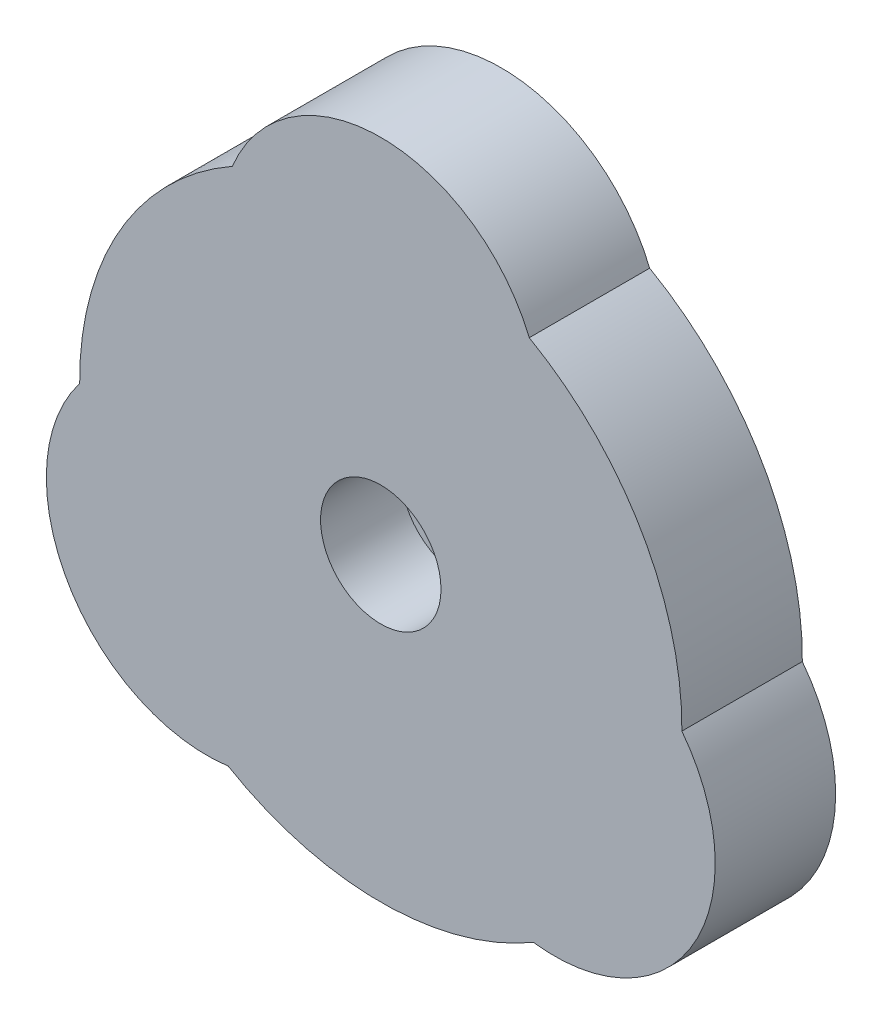
ISO-10303-21;
HEADER;
FILE_DESCRIPTION(('STEP AP214'),'2;1');
FILE_NAME('part.step','',(''),(''),'','','');
FILE_SCHEMA(('AUTOMOTIVE_DESIGN { 1 0 10303 214 1 1 1 1 }'));
ENDSEC;
DATA;
#1=APPLICATION_CONTEXT('core data for automotive mechanical design processes');
#2=APPLICATION_PROTOCOL_DEFINITION('international standard','automotive_design',2000,#1);
#3=PRODUCT_CONTEXT('',#1,'mechanical');
#4=PRODUCT('Part','Part','',(#3));
#5=PRODUCT_RELATED_PRODUCT_CATEGORY('part','',(#4));
#6=PRODUCT_DEFINITION_FORMATION('','',#4);
#7=PRODUCT_DEFINITION_CONTEXT('part definition',#1,'design');
#8=PRODUCT_DEFINITION('design','',#6,#7);
#9=PRODUCT_DEFINITION_SHAPE('','',#8);
#10=(LENGTH_UNIT() NAMED_UNIT(*) SI_UNIT(.MILLI.,.METRE.));
#11=(NAMED_UNIT(*) PLANE_ANGLE_UNIT() SI_UNIT($,.RADIAN.));
#12=(NAMED_UNIT(*) SI_UNIT($,.STERADIAN.) SOLID_ANGLE_UNIT());
#13=UNCERTAINTY_MEASURE_WITH_UNIT(LENGTH_MEASURE(1.E-05),#10,'distance_accuracy_value','');
#14=(GEOMETRIC_REPRESENTATION_CONTEXT(3) GLOBAL_UNCERTAINTY_ASSIGNED_CONTEXT((#13)) GLOBAL_UNIT_ASSIGNED_CONTEXT((#10,
#11,#12)) REPRESENTATION_CONTEXT('',''));
#15=CARTESIAN_POINT('',(0.,0.,0.));
#16=DIRECTION('',(0.,0.,1.));
#17=DIRECTION('',(1.,0.,0.));
#18=AXIS2_PLACEMENT_3D('',#15,#16,#17);
#19=CARTESIAN_POINT('',(0.,0.,6.));
#20=DIRECTION('',(0.,0.,-1.));
#21=DIRECTION('',(-1.,0.,0.));
#22=AXIS2_PLACEMENT_3D('',#19,#20,#21);
#23=CYLINDRICAL_SURFACE('',#22,15.);
#24=CARTESIAN_POINT('',(0.,0.,0.));
#25=DIRECTION('',(0.,0.,1.));
#26=DIRECTION('',(1.,0.,0.));
#27=AXIS2_PLACEMENT_3D('',#24,#25,#26);
#28=CIRCLE('',#27,15.);
#29=CARTESIAN_POINT('',(-7.39577582137263,13.05,0.));
#30=VERTEX_POINT('',#29);
#31=CARTESIAN_POINT('',(-14.9995194300732,-0.1200702579972,0.));
#32=VERTEX_POINT('',#31);
#33=EDGE_CURVE('E95',#30,#32,#28,.T.);
#34=ORIENTED_EDGE('',*,*,#33,.T.);
#35=DIRECTION('',(0.,0.,1.));
#36=VECTOR('',#35,1.);
#37=CARTESIAN_POINT('',(-14.9995194300732,-0.1200702579972,3.));
#38=LINE('',#37,#36);
#39=CARTESIAN_POINT('',(-14.9995194300732,-0.1200702579972,6.));
#40=VERTEX_POINT('',#39);
#41=EDGE_CURVE('E83',#32,#40,#38,.T.);
#42=ORIENTED_EDGE('',*,*,#41,.T.);
#43=CARTESIAN_POINT('',(0.,0.,6.));
#44=DIRECTION('',(0.,0.,1.));
#45=DIRECTION('',(1.,0.,0.));
#46=AXIS2_PLACEMENT_3D('',#43,#44,#45);
#47=CIRCLE('',#46,15.);
#48=CARTESIAN_POINT('',(-7.39577582137263,13.05,6.));
#49=VERTEX_POINT('',#48);
#50=EDGE_CURVE('E11',#49,#40,#47,.T.);
#51=ORIENTED_EDGE('',*,*,#50,.F.);
#52=DIRECTION('',(0.,0.,1.));
#53=VECTOR('',#52,1.);
#54=CARTESIAN_POINT('',(-7.39577582137263,13.05,3.));
#55=LINE('',#54,#53);
#56=EDGE_CURVE('E109',#49,#30,#55,.F.);
#57=ORIENTED_EDGE('',*,*,#56,.T.);
#58=EDGE_LOOP('',(#34,#42,#51,#57));
#59=FACE_BOUND('',#58,.T.);
#60=ADVANCED_FACE('F31',(#59),#23,.T.);
#61=CARTESIAN_POINT('',(-7.60374360870028,-12.9299297420036,6.));
#62=VERTEX_POINT('',#61);
#63=CARTESIAN_POINT('',(7.60374360870094,-12.9299297420032,6.));
#64=VERTEX_POINT('',#63);
#65=EDGE_CURVE('E39',#62,#64,#47,.T.);
#66=ORIENTED_EDGE('',*,*,#65,.F.);
#67=DIRECTION('',(0.,0.,1.));
#68=VECTOR('',#67,1.);
#69=CARTESIAN_POINT('',(-7.60374360870028,-12.9299297420036,3.));
#70=LINE('',#69,#68);
#71=CARTESIAN_POINT('',(-7.60374360870028,-12.9299297420036,0.));
#72=VERTEX_POINT('',#71);
#73=EDGE_CURVE('E86',#62,#72,#70,.F.);
#74=ORIENTED_EDGE('',*,*,#73,.T.);
#75=CARTESIAN_POINT('',(7.60374360870094,-12.9299297420032,0.));
#76=VERTEX_POINT('',#75);
#77=EDGE_CURVE('E123',#72,#76,#28,.T.);
#78=ORIENTED_EDGE('',*,*,#77,.T.);
#79=DIRECTION('',(0.,0.,1.));
#80=VECTOR('',#79,1.);
#81=CARTESIAN_POINT('',(7.60374360870094,-12.9299297420032,3.));
#82=LINE('',#81,#80);
#83=EDGE_CURVE('E107',#76,#64,#82,.T.);
#84=ORIENTED_EDGE('',*,*,#83,.T.);
#85=EDGE_LOOP('',(#66,#74,#78,#84));
#86=FACE_BOUND('',#85,.T.);
#87=ADVANCED_FACE('F142',(#86),#23,.T.);
#88=CARTESIAN_POINT('',(14.9995194300732,-0.12007025799595,6.));
#89=VERTEX_POINT('',#88);
#90=CARTESIAN_POINT('',(7.39577582137263,13.05,6.));
#91=VERTEX_POINT('',#90);
#92=EDGE_CURVE('E40',#89,#91,#47,.T.);
#93=ORIENTED_EDGE('',*,*,#92,.F.);
#94=DIRECTION('',(0.,0.,1.));
#95=VECTOR('',#94,1.);
#96=CARTESIAN_POINT('',(14.9995194300732,-0.120070257995951,3.));
#97=LINE('',#96,#95);
#98=CARTESIAN_POINT('',(14.9995194300732,-0.120070257995951,0.));
#99=VERTEX_POINT('',#98);
#100=EDGE_CURVE('E127',#89,#99,#97,.F.);
#101=ORIENTED_EDGE('',*,*,#100,.T.);
#102=CARTESIAN_POINT('',(7.39577582137263,13.05,0.));
#103=VERTEX_POINT('',#102);
#104=EDGE_CURVE('E122',#99,#103,#28,.T.);
#105=ORIENTED_EDGE('',*,*,#104,.T.);
#106=DIRECTION('',(0.,0.,1.));
#107=VECTOR('',#106,1.);
#108=CARTESIAN_POINT('',(7.39577582137263,13.05,3.));
#109=LINE('',#108,#107);
#110=EDGE_CURVE('E112',#103,#91,#109,.T.);
#111=ORIENTED_EDGE('',*,*,#110,.T.);
#112=EDGE_LOOP('',(#93,#101,#105,#111));
#113=FACE_BOUND('',#112,.T.);
#114=ADVANCED_FACE('F33',(#113),#23,.T.);
#115=CARTESIAN_POINT('',(0.,0.,6.));
#116=DIRECTION('',(0.,0.,1.));
#117=DIRECTION('',(1.,0.,0.));
#118=AXIS2_PLACEMENT_3D('',#115,#116,#117);
#119=PLANE('',#118);
#120=ORIENTED_EDGE('',*,*,#50,.T.);
#121=CARTESIAN_POINT('',(-8.66025403784405,-5.00000000000019,6.));
#122=DIRECTION('',(0.,0.,1.));
#123=DIRECTION('',(-1.,0.,0.));
#124=AXIS2_PLACEMENT_3D('',#121,#122,#123);
#125=CIRCLE('',#124,8.);
#126=EDGE_CURVE('E46',#40,#62,#125,.T.);
#127=ORIENTED_EDGE('',*,*,#126,.T.);
#128=ORIENTED_EDGE('',*,*,#65,.T.);
#129=CARTESIAN_POINT('',(8.66025403784472,-4.9999999999998,6.));
#130=DIRECTION('',(0.,0.,1.));
#131=DIRECTION('',(-1.,0.,0.));
#132=AXIS2_PLACEMENT_3D('',#129,#130,#131);
#133=CIRCLE('',#132,8.);
#134=EDGE_CURVE('E52',#64,#89,#133,.T.);
#135=ORIENTED_EDGE('',*,*,#134,.T.);
#136=ORIENTED_EDGE('',*,*,#92,.T.);
#137=CARTESIAN_POINT('',(0.,10.,6.));
#138=DIRECTION('',(0.,0.,1.));
#139=DIRECTION('',(-1.,0.,0.));
#140=AXIS2_PLACEMENT_3D('',#137,#138,#139);
#141=CIRCLE('',#140,8.);
#142=EDGE_CURVE('E100',#91,#49,#141,.T.);
#143=ORIENTED_EDGE('',*,*,#142,.T.);
#144=EDGE_LOOP('',(#120,#127,#128,#135,#136,#143));
#145=FACE_BOUND('',#144,.T.);
#146=CARTESIAN_POINT('',(0.,0.,6.));
#147=DIRECTION('',(0.,0.,1.));
#148=DIRECTION('',(1.,0.,0.));
#149=AXIS2_PLACEMENT_3D('',#146,#147,#148);
#150=CIRCLE('',#149,3.);
#151=CARTESIAN_POINT('',(3.,0.,6.));
#152=VERTEX_POINT('',#151);
#153=EDGE_CURVE('E114',#152,#152,#150,.T.);
#154=ORIENTED_EDGE('',*,*,#153,.F.);
#155=EDGE_LOOP('',(#154));
#156=FACE_BOUND('',#155,.T.);
#157=ADVANCED_FACE('F97',(#145,#156),#119,.T.);
#158=CARTESIAN_POINT('',(0.,0.,0.));
#159=DIRECTION('',(0.,0.,1.));
#160=DIRECTION('',(1.,0.,0.));
#161=AXIS2_PLACEMENT_3D('',#158,#159,#160);
#162=PLANE('',#161);
#163=ORIENTED_EDGE('',*,*,#77,.F.);
#164=CARTESIAN_POINT('',(-8.66025403784405,-5.00000000000019,0.));
#165=DIRECTION('',(0.,0.,1.));
#166=DIRECTION('',(-1.,0.,0.));
#167=AXIS2_PLACEMENT_3D('',#164,#165,#166);
#168=CIRCLE('',#167,8.);
#169=EDGE_CURVE('E88',#32,#72,#168,.T.);
#170=ORIENTED_EDGE('',*,*,#169,.F.);
#171=ORIENTED_EDGE('',*,*,#33,.F.);
#172=CARTESIAN_POINT('',(0.,10.,0.));
#173=DIRECTION('',(0.,0.,1.));
#174=DIRECTION('',(-1.,0.,0.));
#175=AXIS2_PLACEMENT_3D('',#172,#173,#174);
#176=CIRCLE('',#175,8.);
#177=EDGE_CURVE('E106',#103,#30,#176,.T.);
#178=ORIENTED_EDGE('',*,*,#177,.F.);
#179=ORIENTED_EDGE('',*,*,#104,.F.);
#180=CARTESIAN_POINT('',(8.66025403784472,-4.9999999999998,0.));
#181=DIRECTION('',(0.,0.,1.));
#182=DIRECTION('',(-1.,0.,0.));
#183=AXIS2_PLACEMENT_3D('',#180,#181,#182);
#184=CIRCLE('',#183,8.);
#185=EDGE_CURVE('E136',#76,#99,#184,.T.);
#186=ORIENTED_EDGE('',*,*,#185,.F.);
#187=EDGE_LOOP('',(#163,#170,#171,#178,#179,#186));
#188=FACE_BOUND('',#187,.T.);
#189=ADVANCED_FACE('F131',(#188),#162,.F.);
#190=CARTESIAN_POINT('',(0.,0.,2.));
#191=DIRECTION('',(0.,0.,1.));
#192=DIRECTION('',(1.,0.,0.));
#193=AXIS2_PLACEMENT_3D('',#190,#191,#192);
#194=CYLINDRICAL_SURFACE('',#193,3.);
#195=CARTESIAN_POINT('',(0.,0.,2.));
#196=DIRECTION('',(0.,0.,1.));
#197=DIRECTION('',(1.,0.,0.));
#198=AXIS2_PLACEMENT_3D('',#195,#196,#197);
#199=CIRCLE('',#198,3.);
#200=CARTESIAN_POINT('',(3.,0.,2.));
#201=VERTEX_POINT('',#200);
#202=EDGE_CURVE('E120',#201,#201,#199,.T.);
#203=ORIENTED_EDGE('',*,*,#202,.F.);
#204=EDGE_LOOP('',(#203));
#205=FACE_BOUND('',#204,.T.);
#206=ORIENTED_EDGE('',*,*,#153,.T.);
#207=EDGE_LOOP('',(#206));
#208=FACE_BOUND('',#207,.T.);
#209=ADVANCED_FACE('F165',(#205,#208),#194,.F.);
#210=CARTESIAN_POINT('',(0.,0.,2.));
#211=DIRECTION('',(0.,0.,1.));
#212=DIRECTION('',(1.,0.,0.));
#213=AXIS2_PLACEMENT_3D('',#210,#211,#212);
#214=PLANE('',#213);
#215=ORIENTED_EDGE('',*,*,#202,.T.);
#216=EDGE_LOOP('',(#215));
#217=FACE_BOUND('',#216,.T.);
#218=ADVANCED_FACE('F152',(#217),#214,.T.);
#219=CARTESIAN_POINT('',(0.,10.,0.));
#220=DIRECTION('',(0.,0.,1.));
#221=DIRECTION('',(1.,0.,0.));
#222=AXIS2_PLACEMENT_3D('',#219,#220,#221);
#223=CYLINDRICAL_SURFACE('',#222,8.);
#224=ORIENTED_EDGE('',*,*,#110,.F.);
#225=ORIENTED_EDGE('',*,*,#177,.T.);
#226=ORIENTED_EDGE('',*,*,#56,.F.);
#227=ORIENTED_EDGE('',*,*,#142,.F.);
#228=EDGE_LOOP('',(#224,#225,#226,#227));
#229=FACE_BOUND('',#228,.T.);
#230=ADVANCED_FACE('F110',(#229),#223,.T.);
#231=CARTESIAN_POINT('',(8.66025403784472,-4.9999999999998,0.));
#232=DIRECTION('',(0.,0.,1.));
#233=DIRECTION('',(1.,0.,0.));
#234=AXIS2_PLACEMENT_3D('',#231,#232,#233);
#235=CYLINDRICAL_SURFACE('',#234,8.);
#236=ORIENTED_EDGE('',*,*,#83,.F.);
#237=ORIENTED_EDGE('',*,*,#185,.T.);
#238=ORIENTED_EDGE('',*,*,#100,.F.);
#239=ORIENTED_EDGE('',*,*,#134,.F.);
#240=EDGE_LOOP('',(#236,#237,#238,#239));
#241=FACE_BOUND('',#240,.T.);
#242=ADVANCED_FACE('F144',(#241),#235,.T.);
#243=CARTESIAN_POINT('',(-8.66025403784405,-5.00000000000019,0.));
#244=DIRECTION('',(0.,0.,1.));
#245=DIRECTION('',(1.,0.,0.));
#246=AXIS2_PLACEMENT_3D('',#243,#244,#245);
#247=CYLINDRICAL_SURFACE('',#246,8.);
#248=ORIENTED_EDGE('',*,*,#41,.F.);
#249=ORIENTED_EDGE('',*,*,#169,.T.);
#250=ORIENTED_EDGE('',*,*,#73,.F.);
#251=ORIENTED_EDGE('',*,*,#126,.F.);
#252=EDGE_LOOP('',(#248,#249,#250,#251));
#253=FACE_BOUND('',#252,.T.);
#254=ADVANCED_FACE('F82',(#253),#247,.T.);
#255=CLOSED_SHELL('',(#60,#87,#114,#157,#189,#209,#218,#230,#242,#254));
#256=MANIFOLD_SOLID_BREP('B2',#255);
#257=ADVANCED_BREP_SHAPE_REPRESENTATION('',(#18,#256),#14);
#258=SHAPE_DEFINITION_REPRESENTATION(#9,#257);
ENDSEC;
END-ISO-10303-21;
